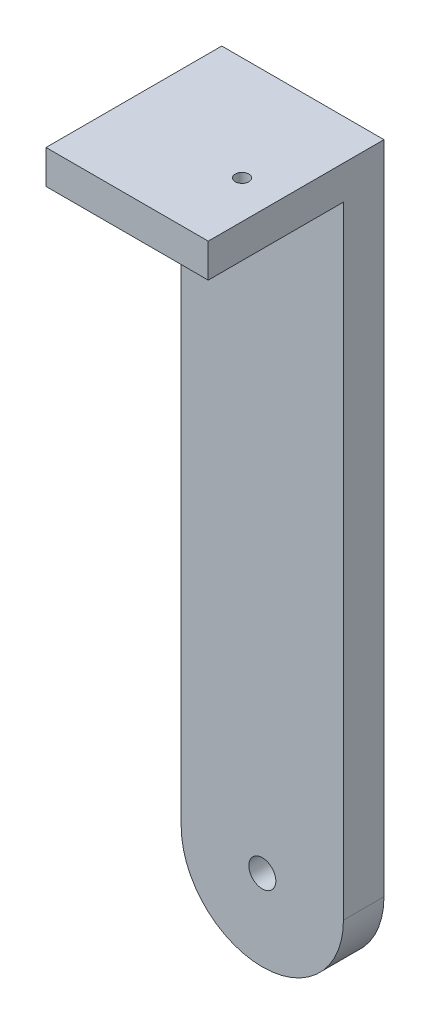
ISO-10303-21;
HEADER;
FILE_DESCRIPTION(('STEP AP214'),'2;1');
FILE_NAME('part.step','',(''),(''),'','','');
FILE_SCHEMA(('AUTOMOTIVE_DESIGN { 1 0 10303 214 1 1 1 1 }'));
ENDSEC;
DATA;
#1=APPLICATION_CONTEXT('core data for automotive mechanical design processes');
#2=APPLICATION_PROTOCOL_DEFINITION('international standard','automotive_design',2000,#1);
#3=PRODUCT_CONTEXT('',#1,'mechanical');
#4=PRODUCT('Part','Part','',(#3));
#5=PRODUCT_RELATED_PRODUCT_CATEGORY('part','',(#4));
#6=PRODUCT_DEFINITION_FORMATION('','',#4);
#7=PRODUCT_DEFINITION_CONTEXT('part definition',#1,'design');
#8=PRODUCT_DEFINITION('design','',#6,#7);
#9=PRODUCT_DEFINITION_SHAPE('','',#8);
#10=(LENGTH_UNIT() NAMED_UNIT(*) SI_UNIT(.MILLI.,.METRE.));
#11=(NAMED_UNIT(*) PLANE_ANGLE_UNIT() SI_UNIT($,.RADIAN.));
#12=(NAMED_UNIT(*) SI_UNIT($,.STERADIAN.) SOLID_ANGLE_UNIT());
#13=UNCERTAINTY_MEASURE_WITH_UNIT(LENGTH_MEASURE(1.E-05),#10,'distance_accuracy_value','');
#14=(GEOMETRIC_REPRESENTATION_CONTEXT(3) GLOBAL_UNCERTAINTY_ASSIGNED_CONTEXT((#13)) GLOBAL_UNIT_ASSIGNED_CONTEXT((#10,
#11,#12)) REPRESENTATION_CONTEXT('',''));
#15=CARTESIAN_POINT('',(0.,0.,0.));
#16=DIRECTION('',(0.,0.,1.));
#17=DIRECTION('',(1.,0.,0.));
#18=AXIS2_PLACEMENT_3D('',#15,#16,#17);
#19=CARTESIAN_POINT('',(0.,0.,30.));
#20=DIRECTION('',(0.,0.,1.));
#21=DIRECTION('',(1.,0.,0.));
#22=AXIS2_PLACEMENT_3D('',#19,#20,#21);
#23=PLANE('',#22);
#24=DIRECTION('',(0.,1.,0.));
#25=VECTOR('',#24,1.);
#26=CARTESIAN_POINT('',(60.,460.,30.));
#27=LINE('',#26,#25);
#28=CARTESIAN_POINT('',(60.,0.,30.));
#29=VERTEX_POINT('',#28);
#30=CARTESIAN_POINT('',(60.,460.,30.));
#31=VERTEX_POINT('',#30);
#32=EDGE_CURVE('E60',#29,#31,#27,.T.);
#33=ORIENTED_EDGE('',*,*,#32,.T.);
#34=DIRECTION('',(-1.,0.,0.));
#35=VECTOR('',#34,1.);
#36=CARTESIAN_POINT('',(-60.,460.,30.));
#37=LINE('',#36,#35);
#38=CARTESIAN_POINT('',(-60.,460.,30.));
#39=VERTEX_POINT('',#38);
#40=EDGE_CURVE('E80',#31,#39,#37,.T.);
#41=ORIENTED_EDGE('',*,*,#40,.T.);
#42=DIRECTION('',(0.,-1.,0.));
#43=VECTOR('',#42,1.);
#44=CARTESIAN_POINT('',(-60.,400.,30.));
#45=LINE('',#44,#43);
#46=CARTESIAN_POINT('',(-60.,0.,30.));
#47=VERTEX_POINT('',#46);
#48=EDGE_CURVE('E98',#39,#47,#45,.T.);
#49=ORIENTED_EDGE('',*,*,#48,.T.);
#50=CARTESIAN_POINT('',(0.,0.,30.));
#51=DIRECTION('',(0.,0.,1.));
#52=DIRECTION('',(1.,0.,0.));
#53=AXIS2_PLACEMENT_3D('',#50,#51,#52);
#54=CIRCLE('',#53,60.);
#55=EDGE_CURVE('E101',#47,#29,#54,.T.);
#56=ORIENTED_EDGE('',*,*,#55,.T.);
#57=EDGE_LOOP('',(#33,#41,#49,#56));
#58=FACE_BOUND('',#57,.T.);
#59=CARTESIAN_POINT('',(0.,0.,30.));
#60=DIRECTION('',(0.,0.,1.));
#61=DIRECTION('',(1.,0.,0.));
#62=AXIS2_PLACEMENT_3D('',#59,#60,#61);
#63=CIRCLE('',#62,10.);
#64=CARTESIAN_POINT('',(10.,0.,30.));
#65=VERTEX_POINT('',#64);
#66=EDGE_CURVE('E107',#65,#65,#63,.T.);
#67=ORIENTED_EDGE('',*,*,#66,.F.);
#68=EDGE_LOOP('',(#67));
#69=FACE_BOUND('',#68,.T.);
#70=ADVANCED_FACE('F39',(#58,#69),#23,.T.);
#71=CARTESIAN_POINT('',(0.,0.,0.));
#72=DIRECTION('',(0.,0.,1.));
#73=DIRECTION('',(1.,0.,0.));
#74=AXIS2_PLACEMENT_3D('',#71,#72,#73);
#75=PLANE('',#74);
#76=DIRECTION('',(0.,-1.,0.));
#77=VECTOR('',#76,1.);
#78=CARTESIAN_POINT('',(-60.,0.,0.));
#79=LINE('',#78,#77);
#80=CARTESIAN_POINT('',(-60.,485.,0.));
#81=VERTEX_POINT('',#80);
#82=CARTESIAN_POINT('',(-60.,0.,0.));
#83=VERTEX_POINT('',#82);
#84=EDGE_CURVE('E66',#81,#83,#79,.T.);
#85=ORIENTED_EDGE('',*,*,#84,.F.);
#86=DIRECTION('',(-1.,0.,0.));
#87=VECTOR('',#86,1.);
#88=CARTESIAN_POINT('',(-60.,485.,0.));
#89=LINE('',#88,#87);
#90=CARTESIAN_POINT('',(60.,485.,0.));
#91=VERTEX_POINT('',#90);
#92=EDGE_CURVE('E94',#91,#81,#89,.T.);
#93=ORIENTED_EDGE('',*,*,#92,.F.);
#94=DIRECTION('',(0.,1.,0.));
#95=VECTOR('',#94,1.);
#96=CARTESIAN_POINT('',(60.,0.,0.));
#97=LINE('',#96,#95);
#98=CARTESIAN_POINT('',(60.,0.,0.));
#99=VERTEX_POINT('',#98);
#100=EDGE_CURVE('E109',#99,#91,#97,.T.);
#101=ORIENTED_EDGE('',*,*,#100,.F.);
#102=CARTESIAN_POINT('',(0.,0.,0.));
#103=DIRECTION('',(0.,0.,1.));
#104=DIRECTION('',(1.,0.,0.));
#105=AXIS2_PLACEMENT_3D('',#102,#103,#104);
#106=CIRCLE('',#105,60.);
#107=EDGE_CURVE('E110',#83,#99,#106,.T.);
#108=ORIENTED_EDGE('',*,*,#107,.F.);
#109=EDGE_LOOP('',(#85,#93,#101,#108));
#110=FACE_BOUND('',#109,.T.);
#111=CARTESIAN_POINT('',(0.,0.,0.));
#112=DIRECTION('',(0.,0.,1.));
#113=DIRECTION('',(1.,0.,0.));
#114=AXIS2_PLACEMENT_3D('',#111,#112,#113);
#115=CIRCLE('',#114,10.);
#116=CARTESIAN_POINT('',(10.,0.,0.));
#117=VERTEX_POINT('',#116);
#118=EDGE_CURVE('E139',#117,#117,#115,.T.);
#119=ORIENTED_EDGE('',*,*,#118,.T.);
#120=EDGE_LOOP('',(#119));
#121=FACE_BOUND('',#120,.T.);
#122=ADVANCED_FACE('F124',(#110,#121),#75,.F.);
#123=CARTESIAN_POINT('',(-60.,0.,30.));
#124=DIRECTION('',(1.,0.,0.));
#125=DIRECTION('',(0.,0.,-1.));
#126=AXIS2_PLACEMENT_3D('',#123,#124,#125);
#127=PLANE('',#126);
#128=ORIENTED_EDGE('',*,*,#84,.T.);
#129=DIRECTION('',(0.,0.,-1.));
#130=VECTOR('',#129,1.);
#131=CARTESIAN_POINT('',(-60.,0.,30.));
#132=LINE('',#131,#130);
#133=EDGE_CURVE('E11',#47,#83,#132,.T.);
#134=ORIENTED_EDGE('',*,*,#133,.F.);
#135=ORIENTED_EDGE('',*,*,#48,.F.);
#136=DIRECTION('',(0.,0.,1.));
#137=VECTOR('',#136,1.);
#138=CARTESIAN_POINT('',(-60.,460.,0.));
#139=LINE('',#138,#137);
#140=CARTESIAN_POINT('',(-60.,460.,130.));
#141=VERTEX_POINT('',#140);
#142=EDGE_CURVE('E81',#39,#141,#139,.T.);
#143=ORIENTED_EDGE('',*,*,#142,.T.);
#144=DIRECTION('',(0.,-1.,0.));
#145=VECTOR('',#144,1.);
#146=CARTESIAN_POINT('',(-60.,460.,130.));
#147=LINE('',#146,#145);
#148=CARTESIAN_POINT('',(-60.,485.,130.));
#149=VERTEX_POINT('',#148);
#150=EDGE_CURVE('E258',#149,#141,#147,.T.);
#151=ORIENTED_EDGE('',*,*,#150,.F.);
#152=DIRECTION('',(0.,0.,1.));
#153=VECTOR('',#152,1.);
#154=CARTESIAN_POINT('',(-60.,485.,0.));
#155=LINE('',#154,#153);
#156=EDGE_CURVE('E131',#81,#149,#155,.T.);
#157=ORIENTED_EDGE('',*,*,#156,.F.);
#158=EDGE_LOOP('',(#128,#134,#135,#143,#151,#157));
#159=FACE_BOUND('',#158,.T.);
#160=ADVANCED_FACE('F41',(#159),#127,.F.);
#161=CARTESIAN_POINT('',(0.,0.,30.));
#162=DIRECTION('',(0.,0.,-1.));
#163=DIRECTION('',(-1.,0.,0.));
#164=AXIS2_PLACEMENT_3D('',#161,#162,#163);
#165=CYLINDRICAL_SURFACE('',#164,60.);
#166=ORIENTED_EDGE('',*,*,#107,.T.);
#167=DIRECTION('',(0.,0.,-1.));
#168=VECTOR('',#167,1.);
#169=CARTESIAN_POINT('',(60.,0.,30.));
#170=LINE('',#169,#168);
#171=EDGE_CURVE('E47',#29,#99,#170,.T.);
#172=ORIENTED_EDGE('',*,*,#171,.F.);
#173=ORIENTED_EDGE('',*,*,#55,.F.);
#174=ORIENTED_EDGE('',*,*,#133,.T.);
#175=EDGE_LOOP('',(#166,#172,#173,#174));
#176=FACE_BOUND('',#175,.T.);
#177=ADVANCED_FACE('F157',(#176),#165,.T.);
#178=CARTESIAN_POINT('',(60.,0.,30.));
#179=DIRECTION('',(-1.,0.,0.));
#180=DIRECTION('',(0.,-1.,0.));
#181=AXIS2_PLACEMENT_3D('',#178,#179,#180);
#182=PLANE('',#181);
#183=ORIENTED_EDGE('',*,*,#100,.T.);
#184=DIRECTION('',(0.,0.,1.));
#185=VECTOR('',#184,1.);
#186=CARTESIAN_POINT('',(60.,485.,0.));
#187=LINE('',#186,#185);
#188=CARTESIAN_POINT('',(60.,485.,130.));
#189=VERTEX_POINT('',#188);
#190=EDGE_CURVE('E137',#91,#189,#187,.T.);
#191=ORIENTED_EDGE('',*,*,#190,.T.);
#192=DIRECTION('',(0.,1.,0.));
#193=VECTOR('',#192,1.);
#194=CARTESIAN_POINT('',(60.,460.,130.));
#195=LINE('',#194,#193);
#196=CARTESIAN_POINT('',(60.,460.,130.));
#197=VERTEX_POINT('',#196);
#198=EDGE_CURVE('E133',#197,#189,#195,.T.);
#199=ORIENTED_EDGE('',*,*,#198,.F.);
#200=DIRECTION('',(0.,0.,1.));
#201=VECTOR('',#200,1.);
#202=CARTESIAN_POINT('',(60.,460.,0.));
#203=LINE('',#202,#201);
#204=EDGE_CURVE('E91',#31,#197,#203,.T.);
#205=ORIENTED_EDGE('',*,*,#204,.F.);
#206=ORIENTED_EDGE('',*,*,#32,.F.);
#207=ORIENTED_EDGE('',*,*,#171,.T.);
#208=EDGE_LOOP('',(#183,#191,#199,#205,#206,#207));
#209=FACE_BOUND('',#208,.T.);
#210=ADVANCED_FACE('F113',(#209),#182,.F.);
#211=CARTESIAN_POINT('',(0.,0.,30.));
#212=DIRECTION('',(0.,0.,-1.));
#213=DIRECTION('',(-1.,0.,0.));
#214=AXIS2_PLACEMENT_3D('',#211,#212,#213);
#215=CYLINDRICAL_SURFACE('',#214,10.);
#216=ORIENTED_EDGE('',*,*,#66,.T.);
#217=EDGE_LOOP('',(#216));
#218=FACE_BOUND('',#217,.T.);
#219=ORIENTED_EDGE('',*,*,#118,.F.);
#220=EDGE_LOOP('',(#219));
#221=FACE_BOUND('',#220,.T.);
#222=ADVANCED_FACE('F148',(#218,#221),#215,.F.);
#223=CARTESIAN_POINT('',(-60.,460.,0.));
#224=DIRECTION('',(0.,-1.,0.));
#225=DIRECTION('',(0.,0.,-1.));
#226=AXIS2_PLACEMENT_3D('',#223,#224,#225);
#227=PLANE('',#226);
#228=CARTESIAN_POINT('',(32.,460.,77.));
#229=DIRECTION('',(0.,-1.,0.));
#230=DIRECTION('',(0.,0.,-1.));
#231=AXIS2_PLACEMENT_3D('',#228,#229,#230);
#232=CIRCLE('',#231,5.);
#233=CARTESIAN_POINT('',(32.,460.,72.));
#234=VERTEX_POINT('',#233);
#235=EDGE_CURVE('E255',#234,#234,#232,.T.);
#236=ORIENTED_EDGE('',*,*,#235,.F.);
#237=EDGE_LOOP('',(#236));
#238=FACE_BOUND('',#237,.T.);
#239=ORIENTED_EDGE('',*,*,#40,.F.);
#240=ORIENTED_EDGE('',*,*,#204,.T.);
#241=DIRECTION('',(1.,0.,0.));
#242=VECTOR('',#241,1.);
#243=CARTESIAN_POINT('',(-60.,460.,130.));
#244=LINE('',#243,#242);
#245=EDGE_CURVE('E90',#141,#197,#244,.T.);
#246=ORIENTED_EDGE('',*,*,#245,.F.);
#247=ORIENTED_EDGE('',*,*,#142,.F.);
#248=EDGE_LOOP('',(#239,#240,#246,#247));
#249=FACE_BOUND('',#248,.T.);
#250=ADVANCED_FACE('F88',(#238,#249),#227,.T.);
#251=CARTESIAN_POINT('',(-60.,485.,0.));
#252=DIRECTION('',(0.,1.,0.));
#253=DIRECTION('',(0.,0.,1.));
#254=AXIS2_PLACEMENT_3D('',#251,#252,#253);
#255=PLANE('',#254);
#256=CARTESIAN_POINT('',(32.,485.,77.));
#257=DIRECTION('',(0.,1.,0.));
#258=DIRECTION('',(0.,0.,1.));
#259=AXIS2_PLACEMENT_3D('',#256,#257,#258);
#260=CIRCLE('',#259,5.);
#261=CARTESIAN_POINT('',(32.,485.,82.));
#262=VERTEX_POINT('',#261);
#263=EDGE_CURVE('E43',#262,#262,#260,.T.);
#264=ORIENTED_EDGE('',*,*,#263,.F.);
#265=EDGE_LOOP('',(#264));
#266=FACE_BOUND('',#265,.T.);
#267=ORIENTED_EDGE('',*,*,#156,.T.);
#268=DIRECTION('',(-1.,0.,0.));
#269=VECTOR('',#268,1.);
#270=CARTESIAN_POINT('',(-60.,485.,130.));
#271=LINE('',#270,#269);
#272=EDGE_CURVE('E126',#189,#149,#271,.T.);
#273=ORIENTED_EDGE('',*,*,#272,.F.);
#274=ORIENTED_EDGE('',*,*,#190,.F.);
#275=ORIENTED_EDGE('',*,*,#92,.T.);
#276=EDGE_LOOP('',(#267,#273,#274,#275));
#277=FACE_BOUND('',#276,.T.);
#278=ADVANCED_FACE('F154',(#266,#277),#255,.T.);
#279=CARTESIAN_POINT('',(0.,0.,130.));
#280=DIRECTION('',(0.,0.,-1.));
#281=DIRECTION('',(-1.,0.,0.));
#282=AXIS2_PLACEMENT_3D('',#279,#280,#281);
#283=PLANE('',#282);
#284=ORIENTED_EDGE('',*,*,#150,.T.);
#285=ORIENTED_EDGE('',*,*,#245,.T.);
#286=ORIENTED_EDGE('',*,*,#198,.T.);
#287=ORIENTED_EDGE('',*,*,#272,.T.);
#288=EDGE_LOOP('',(#284,#285,#286,#287));
#289=FACE_BOUND('',#288,.T.);
#290=ADVANCED_FACE('F181',(#289),#283,.F.);
#291=CARTESIAN_POINT('',(32.,530.,77.));
#292=DIRECTION('',(0.,-1.,0.));
#293=DIRECTION('',(0.,0.,-1.));
#294=AXIS2_PLACEMENT_3D('',#291,#292,#293);
#295=CYLINDRICAL_SURFACE('',#294,5.);
#296=ORIENTED_EDGE('',*,*,#263,.T.);
#297=EDGE_LOOP('',(#296));
#298=FACE_BOUND('',#297,.T.);
#299=ORIENTED_EDGE('',*,*,#235,.T.);
#300=EDGE_LOOP('',(#299));
#301=FACE_BOUND('',#300,.T.);
#302=ADVANCED_FACE('F188',(#298,#301),#295,.F.);
#303=CLOSED_SHELL('',(#70,#122,#160,#177,#210,#222,#250,#278,#290,#302));
#304=MANIFOLD_SOLID_BREP('B2',#303);
#305=ADVANCED_BREP_SHAPE_REPRESENTATION('',(#18,#304),#14);
#306=SHAPE_DEFINITION_REPRESENTATION(#9,#305);
ENDSEC;
END-ISO-10303-21;
